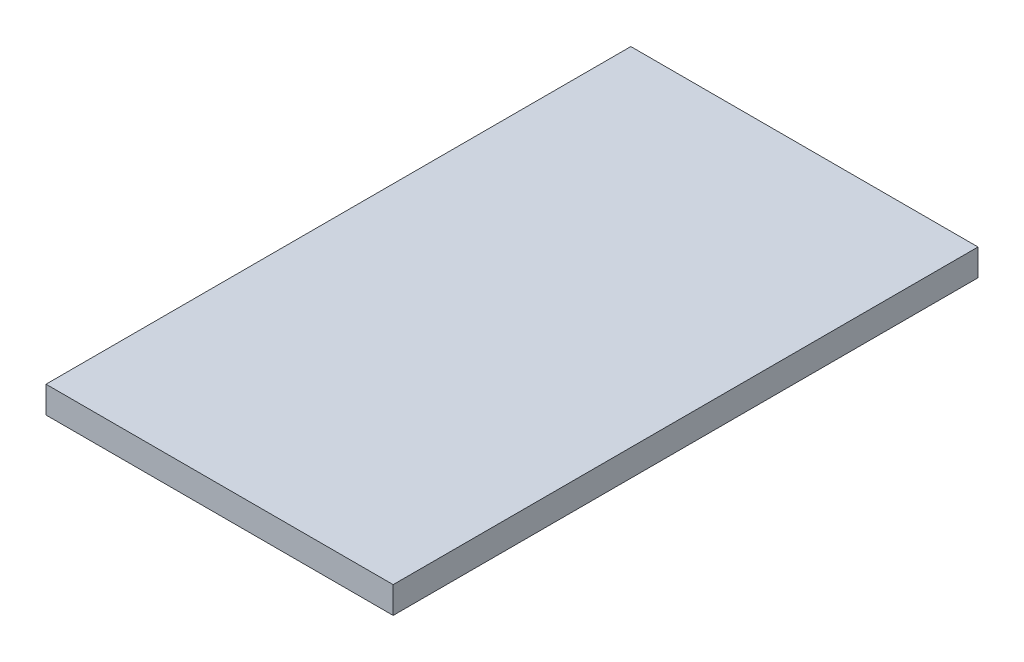
ISO-10303-21;
HEADER;
FILE_DESCRIPTION(('STEP AP214'),'2;1');
FILE_NAME('part.step','',(''),(''),'','','');
FILE_SCHEMA(('AUTOMOTIVE_DESIGN { 1 0 10303 214 1 1 1 1 }'));
ENDSEC;
DATA;
#1=APPLICATION_CONTEXT('core data for automotive mechanical design processes');
#2=APPLICATION_PROTOCOL_DEFINITION('international standard','automotive_design',2000,#1);
#3=PRODUCT_CONTEXT('',#1,'mechanical');
#4=PRODUCT('Part','Part','',(#3));
#5=PRODUCT_RELATED_PRODUCT_CATEGORY('part','',(#4));
#6=PRODUCT_DEFINITION_FORMATION('','',#4);
#7=PRODUCT_DEFINITION_CONTEXT('part definition',#1,'design');
#8=PRODUCT_DEFINITION('design','',#6,#7);
#9=PRODUCT_DEFINITION_SHAPE('','',#8);
#10=(LENGTH_UNIT() NAMED_UNIT(*) SI_UNIT(.MILLI.,.METRE.));
#11=(NAMED_UNIT(*) PLANE_ANGLE_UNIT() SI_UNIT($,.RADIAN.));
#12=(NAMED_UNIT(*) SI_UNIT($,.STERADIAN.) SOLID_ANGLE_UNIT());
#13=UNCERTAINTY_MEASURE_WITH_UNIT(LENGTH_MEASURE(1.E-05),#10,'distance_accuracy_value','');
#14=(GEOMETRIC_REPRESENTATION_CONTEXT(3) GLOBAL_UNCERTAINTY_ASSIGNED_CONTEXT((#13)) GLOBAL_UNIT_ASSIGNED_CONTEXT((#10,
#11,#12)) REPRESENTATION_CONTEXT('',''));
#15=CARTESIAN_POINT('',(0.,0.,0.));
#16=DIRECTION('',(0.,0.,1.));
#17=DIRECTION('',(1.,0.,0.));
#18=AXIS2_PLACEMENT_3D('',#15,#16,#17);
#19=CARTESIAN_POINT('',(-6.5,1.,10.95));
#20=DIRECTION('',(1.,0.,0.));
#21=DIRECTION('',(0.,0.,-1.));
#22=AXIS2_PLACEMENT_3D('',#19,#20,#21);
#23=PLANE('',#22);
#24=DIRECTION('',(0.,0.,1.));
#25=VECTOR('',#24,1.);
#26=CARTESIAN_POINT('',(-6.5,0.,10.95));
#27=LINE('',#26,#25);
#28=CARTESIAN_POINT('',(-6.5,0.,-10.95));
#29=VERTEX_POINT('',#28);
#30=CARTESIAN_POINT('',(-6.5,0.,10.95));
#31=VERTEX_POINT('',#30);
#32=EDGE_CURVE('E96',#29,#31,#27,.T.);
#33=ORIENTED_EDGE('',*,*,#32,.T.);
#34=DIRECTION('',(0.,-1.,0.));
#35=VECTOR('',#34,1.);
#36=CARTESIAN_POINT('',(-6.5,1.,10.95));
#37=LINE('',#36,#35);
#38=CARTESIAN_POINT('',(-6.5,1.,10.95));
#39=VERTEX_POINT('',#38);
#40=EDGE_CURVE('E11',#39,#31,#37,.T.);
#41=ORIENTED_EDGE('',*,*,#40,.F.);
#42=DIRECTION('',(0.,0.,1.));
#43=VECTOR('',#42,1.);
#44=CARTESIAN_POINT('',(-6.5,1.,10.95));
#45=LINE('',#44,#43);
#46=CARTESIAN_POINT('',(-6.5,1.,-10.95));
#47=VERTEX_POINT('',#46);
#48=EDGE_CURVE('E84',#47,#39,#45,.T.);
#49=ORIENTED_EDGE('',*,*,#48,.F.);
#50=DIRECTION('',(0.,-1.,0.));
#51=VECTOR('',#50,1.);
#52=CARTESIAN_POINT('',(-6.5,1.,-10.95));
#53=LINE('',#52,#51);
#54=EDGE_CURVE('E92',#47,#29,#53,.T.);
#55=ORIENTED_EDGE('',*,*,#54,.T.);
#56=EDGE_LOOP('',(#33,#41,#49,#55));
#57=FACE_BOUND('',#56,.T.);
#58=ADVANCED_FACE('F33',(#57),#23,.F.);
#59=CARTESIAN_POINT('',(6.5,1.,10.95));
#60=DIRECTION('',(0.,0.,-1.));
#61=DIRECTION('',(-1.,0.,0.));
#62=AXIS2_PLACEMENT_3D('',#59,#60,#61);
#63=PLANE('',#62);
#64=DIRECTION('',(1.,0.,0.));
#65=VECTOR('',#64,1.);
#66=CARTESIAN_POINT('',(6.5,0.,10.95));
#67=LINE('',#66,#65);
#68=CARTESIAN_POINT('',(6.5,0.,10.95));
#69=VERTEX_POINT('',#68);
#70=EDGE_CURVE('E88',#31,#69,#67,.T.);
#71=ORIENTED_EDGE('',*,*,#70,.T.);
#72=DIRECTION('',(0.,-1.,0.));
#73=VECTOR('',#72,1.);
#74=CARTESIAN_POINT('',(6.5,1.,10.95));
#75=LINE('',#74,#73);
#76=CARTESIAN_POINT('',(6.5,1.,10.95));
#77=VERTEX_POINT('',#76);
#78=EDGE_CURVE('E41',#77,#69,#75,.T.);
#79=ORIENTED_EDGE('',*,*,#78,.F.);
#80=DIRECTION('',(1.,0.,0.));
#81=VECTOR('',#80,1.);
#82=CARTESIAN_POINT('',(6.5,1.,10.95));
#83=LINE('',#82,#81);
#84=EDGE_CURVE('E79',#39,#77,#83,.T.);
#85=ORIENTED_EDGE('',*,*,#84,.F.);
#86=ORIENTED_EDGE('',*,*,#40,.T.);
#87=EDGE_LOOP('',(#71,#79,#85,#86));
#88=FACE_BOUND('',#87,.T.);
#89=ADVANCED_FACE('F87',(#88),#63,.F.);
#90=CARTESIAN_POINT('',(6.5,1.,10.95));
#91=DIRECTION('',(-1.,0.,0.));
#92=DIRECTION('',(0.,0.,1.));
#93=AXIS2_PLACEMENT_3D('',#90,#91,#92);
#94=PLANE('',#93);
#95=DIRECTION('',(0.,0.,-1.));
#96=VECTOR('',#95,1.);
#97=CARTESIAN_POINT('',(6.5,0.,10.95));
#98=LINE('',#97,#96);
#99=CARTESIAN_POINT('',(6.5,0.,-10.95));
#100=VERTEX_POINT('',#99);
#101=EDGE_CURVE('E66',#69,#100,#98,.T.);
#102=ORIENTED_EDGE('',*,*,#101,.T.);
#103=DIRECTION('',(0.,-1.,0.));
#104=VECTOR('',#103,1.);
#105=CARTESIAN_POINT('',(6.5,1.,-10.95));
#106=LINE('',#105,#104);
#107=CARTESIAN_POINT('',(6.5,1.,-10.95));
#108=VERTEX_POINT('',#107);
#109=EDGE_CURVE('E89',#108,#100,#106,.T.);
#110=ORIENTED_EDGE('',*,*,#109,.F.);
#111=DIRECTION('',(0.,0.,-1.));
#112=VECTOR('',#111,1.);
#113=CARTESIAN_POINT('',(6.5,1.,10.95));
#114=LINE('',#113,#112);
#115=EDGE_CURVE('E82',#77,#108,#114,.T.);
#116=ORIENTED_EDGE('',*,*,#115,.F.);
#117=ORIENTED_EDGE('',*,*,#78,.T.);
#118=EDGE_LOOP('',(#102,#110,#116,#117));
#119=FACE_BOUND('',#118,.T.);
#120=ADVANCED_FACE('F90',(#119),#94,.F.);
#121=CARTESIAN_POINT('',(6.5,1.,-10.95));
#122=DIRECTION('',(0.,0.,1.));
#123=DIRECTION('',(1.,0.,0.));
#124=AXIS2_PLACEMENT_3D('',#121,#122,#123);
#125=PLANE('',#124);
#126=DIRECTION('',(-1.,0.,0.));
#127=VECTOR('',#126,1.);
#128=CARTESIAN_POINT('',(6.5,0.,-10.95));
#129=LINE('',#128,#127);
#130=EDGE_CURVE('E72',#100,#29,#129,.T.);
#131=ORIENTED_EDGE('',*,*,#130,.T.);
#132=ORIENTED_EDGE('',*,*,#54,.F.);
#133=DIRECTION('',(-1.,0.,0.));
#134=VECTOR('',#133,1.);
#135=CARTESIAN_POINT('',(6.5,1.,-10.95));
#136=LINE('',#135,#134);
#137=EDGE_CURVE('E49',#108,#47,#136,.T.);
#138=ORIENTED_EDGE('',*,*,#137,.F.);
#139=ORIENTED_EDGE('',*,*,#109,.T.);
#140=EDGE_LOOP('',(#131,#132,#138,#139));
#141=FACE_BOUND('',#140,.T.);
#142=ADVANCED_FACE('F103',(#141),#125,.F.);
#143=CARTESIAN_POINT('',(0.,1.,0.));
#144=DIRECTION('',(0.,1.,0.));
#145=DIRECTION('',(0.,0.,1.));
#146=AXIS2_PLACEMENT_3D('',#143,#144,#145);
#147=PLANE('',#146);
#148=ORIENTED_EDGE('',*,*,#48,.T.);
#149=ORIENTED_EDGE('',*,*,#84,.T.);
#150=ORIENTED_EDGE('',*,*,#115,.T.);
#151=ORIENTED_EDGE('',*,*,#137,.T.);
#152=EDGE_LOOP('',(#148,#149,#150,#151));
#153=FACE_BOUND('',#152,.T.);
#154=ADVANCED_FACE('F80',(#153),#147,.T.);
#155=CARTESIAN_POINT('',(0.,0.,0.));
#156=DIRECTION('',(0.,1.,0.));
#157=DIRECTION('',(0.,0.,1.));
#158=AXIS2_PLACEMENT_3D('',#155,#156,#157);
#159=PLANE('',#158);
#160=ORIENTED_EDGE('',*,*,#32,.F.);
#161=ORIENTED_EDGE('',*,*,#130,.F.);
#162=ORIENTED_EDGE('',*,*,#101,.F.);
#163=ORIENTED_EDGE('',*,*,#70,.F.);
#164=EDGE_LOOP('',(#160,#161,#162,#163));
#165=FACE_BOUND('',#164,.T.);
#166=ADVANCED_FACE('F106',(#165),#159,.F.);
#167=CLOSED_SHELL('',(#58,#89,#120,#142,#154,#166));
#168=MANIFOLD_SOLID_BREP('B2',#167);
#169=ADVANCED_BREP_SHAPE_REPRESENTATION('',(#18,#168),#14);
#170=SHAPE_DEFINITION_REPRESENTATION(#9,#169);
ENDSEC;
END-ISO-10303-21;
